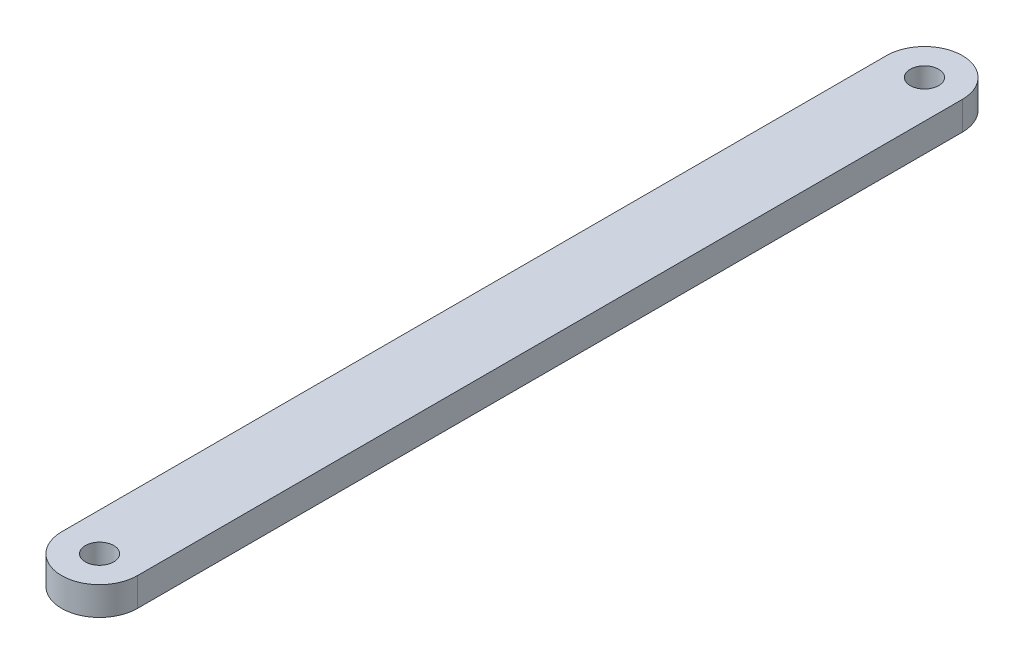
ISO-10303-21;
HEADER;
FILE_DESCRIPTION(('STEP AP214'),'2;1');
FILE_NAME('part.step','',(''),(''),'','','');
FILE_SCHEMA(('AUTOMOTIVE_DESIGN { 1 0 10303 214 1 1 1 1 }'));
ENDSEC;
DATA;
#1=APPLICATION_CONTEXT('core data for automotive mechanical design processes');
#2=APPLICATION_PROTOCOL_DEFINITION('international standard','automotive_design',2000,#1);
#3=PRODUCT_CONTEXT('',#1,'mechanical');
#4=PRODUCT('Part','Part','',(#3));
#5=PRODUCT_RELATED_PRODUCT_CATEGORY('part','',(#4));
#6=PRODUCT_DEFINITION_FORMATION('','',#4);
#7=PRODUCT_DEFINITION_CONTEXT('part definition',#1,'design');
#8=PRODUCT_DEFINITION('design','',#6,#7);
#9=PRODUCT_DEFINITION_SHAPE('','',#8);
#10=(LENGTH_UNIT() NAMED_UNIT(*) SI_UNIT(.MILLI.,.METRE.));
#11=(NAMED_UNIT(*) PLANE_ANGLE_UNIT() SI_UNIT($,.RADIAN.));
#12=(NAMED_UNIT(*) SI_UNIT($,.STERADIAN.) SOLID_ANGLE_UNIT());
#13=UNCERTAINTY_MEASURE_WITH_UNIT(LENGTH_MEASURE(1.E-05),#10,'distance_accuracy_value','');
#14=(GEOMETRIC_REPRESENTATION_CONTEXT(3) GLOBAL_UNCERTAINTY_ASSIGNED_CONTEXT((#13)) GLOBAL_UNIT_ASSIGNED_CONTEXT((#10,
#11,#12)) REPRESENTATION_CONTEXT('',''));
#15=CARTESIAN_POINT('',(0.,0.,0.));
#16=DIRECTION('',(0.,0.,1.));
#17=DIRECTION('',(1.,0.,0.));
#18=AXIS2_PLACEMENT_3D('',#15,#16,#17);
#19=CARTESIAN_POINT('',(41836.1732579615,-395.939495491806,-43.0000000000018));
#20=DIRECTION('',(0.,-1.,0.));
#21=DIRECTION('',(1.,0.,0.));
#22=AXIS2_PLACEMENT_3D('',#19,#20,#21);
#23=PLANE('',#22);
#24=CARTESIAN_POINT('',(41836.1732579615,-395.939495491806,43.9999999999982));
#25=DIRECTION('',(0.,-1.,0.));
#26=DIRECTION('',(1.,0.,0.));
#27=AXIS2_PLACEMENT_3D('',#24,#25,#26);
#28=CIRCLE('',#27,1.50000000000178);
#29=CARTESIAN_POINT('',(41837.6732579615,-395.939495491806,43.9999999999982));
#30=VERTEX_POINT('',#29);
#31=EDGE_CURVE('E107',#30,#30,#28,.T.);
#32=ORIENTED_EDGE('',*,*,#31,.F.);
#33=EDGE_LOOP('',(#32));
#34=FACE_BOUND('',#33,.T.);
#35=CARTESIAN_POINT('',(41836.1732579615,-395.939495491806,-43.0000000000018));
#36=DIRECTION('',(0.,-1.,0.));
#37=DIRECTION('',(1.,0.,0.));
#38=AXIS2_PLACEMENT_3D('',#35,#36,#37);
#39=CIRCLE('',#38,4.00000000000134);
#40=CARTESIAN_POINT('',(41832.1732579615,-395.939495491806,-43.0000000000018));
#41=VERTEX_POINT('',#40);
#42=CARTESIAN_POINT('',(41840.1732579615,-395.939495491806,-43.0000000000018));
#43=VERTEX_POINT('',#42);
#44=EDGE_CURVE('E90',#41,#43,#39,.T.);
#45=ORIENTED_EDGE('',*,*,#44,.T.);
#46=DIRECTION('',(0.,0.,1.));
#47=VECTOR('',#46,1.);
#48=CARTESIAN_POINT('',(41840.1732579615,-395.939495491806,-41.0000000000018));
#49=LINE('',#48,#47);
#50=CARTESIAN_POINT('',(41840.1732579615,-395.939495491806,43.9999999999982));
#51=VERTEX_POINT('',#50);
#52=EDGE_CURVE('E84',#43,#51,#49,.T.);
#53=ORIENTED_EDGE('',*,*,#52,.T.);
#54=CARTESIAN_POINT('',(41836.1732579615,-395.939495491806,43.9999999999982));
#55=DIRECTION('',(0.,-1.,0.));
#56=DIRECTION('',(1.,0.,0.));
#57=AXIS2_PLACEMENT_3D('',#54,#55,#56);
#58=CIRCLE('',#57,4.00000000000489);
#59=CARTESIAN_POINT('',(41832.1732579615,-395.939495491806,43.9999999999982));
#60=VERTEX_POINT('',#59);
#61=EDGE_CURVE('E87',#51,#60,#58,.T.);
#62=ORIENTED_EDGE('',*,*,#61,.T.);
#63=DIRECTION('',(0.,0.,-1.));
#64=VECTOR('',#63,1.);
#65=CARTESIAN_POINT('',(41832.1732579615,-395.939495491806,43.9999999999982));
#66=LINE('',#65,#64);
#67=EDGE_CURVE('E56',#60,#41,#66,.T.);
#68=ORIENTED_EDGE('',*,*,#67,.T.);
#69=EDGE_LOOP('',(#45,#53,#62,#68));
#70=FACE_BOUND('',#69,.T.);
#71=CARTESIAN_POINT('',(41836.1732579615,-395.939495491806,-43.0000000000018));
#72=DIRECTION('',(0.,-1.,0.));
#73=DIRECTION('',(1.,0.,0.));
#74=AXIS2_PLACEMENT_3D('',#71,#72,#73);
#75=CIRCLE('',#74,1.50000000000178);
#76=CARTESIAN_POINT('',(41837.6732579615,-395.939495491806,-43.0000000000018));
#77=VERTEX_POINT('',#76);
#78=EDGE_CURVE('E119',#77,#77,#75,.T.);
#79=ORIENTED_EDGE('',*,*,#78,.F.);
#80=EDGE_LOOP('',(#79));
#81=FACE_BOUND('',#80,.T.);
#82=ADVANCED_FACE('F39',(#34,#70,#81),#23,.T.);
#83=CARTESIAN_POINT('',(41836.1732579615,-392.939495491806,-43.0000000000018));
#84=DIRECTION('',(0.,-1.,0.));
#85=DIRECTION('',(1.,0.,0.));
#86=AXIS2_PLACEMENT_3D('',#83,#84,#85);
#87=PLANE('',#86);
#88=CARTESIAN_POINT('',(41836.1732579615,-392.939495491806,-43.0000000000018));
#89=DIRECTION('',(0.,-1.,0.));
#90=DIRECTION('',(1.,0.,0.));
#91=AXIS2_PLACEMENT_3D('',#88,#89,#90);
#92=CIRCLE('',#91,4.00000000000134);
#93=CARTESIAN_POINT('',(41832.1732579615,-392.939495491806,-43.0000000000018));
#94=VERTEX_POINT('',#93);
#95=CARTESIAN_POINT('',(41840.1732579615,-392.939495491806,-43.0000000000018));
#96=VERTEX_POINT('',#95);
#97=EDGE_CURVE('E104',#94,#96,#92,.T.);
#98=ORIENTED_EDGE('',*,*,#97,.F.);
#99=DIRECTION('',(0.,0.,-1.));
#100=VECTOR('',#99,1.);
#101=CARTESIAN_POINT('',(41832.1732579615,-392.939495491806,-41.0000000000018));
#102=LINE('',#101,#100);
#103=CARTESIAN_POINT('',(41832.1732579615,-392.939495491806,43.9999999999982));
#104=VERTEX_POINT('',#103);
#105=EDGE_CURVE('E73',#104,#94,#102,.T.);
#106=ORIENTED_EDGE('',*,*,#105,.F.);
#107=CARTESIAN_POINT('',(41836.1732579615,-392.939495491806,43.9999999999982));
#108=DIRECTION('',(0.,-1.,0.));
#109=DIRECTION('',(1.,0.,0.));
#110=AXIS2_PLACEMENT_3D('',#107,#108,#109);
#111=CIRCLE('',#110,4.00000000000489);
#112=CARTESIAN_POINT('',(41840.1732579615,-392.939495491806,43.9999999999982));
#113=VERTEX_POINT('',#112);
#114=EDGE_CURVE('E109',#113,#104,#111,.T.);
#115=ORIENTED_EDGE('',*,*,#114,.F.);
#116=DIRECTION('',(0.,0.,1.));
#117=VECTOR('',#116,1.);
#118=CARTESIAN_POINT('',(41840.1732579615,-392.939495491806,-41.0000000000018));
#119=LINE('',#118,#117);
#120=EDGE_CURVE('E95',#96,#113,#119,.T.);
#121=ORIENTED_EDGE('',*,*,#120,.F.);
#122=EDGE_LOOP('',(#98,#106,#115,#121));
#123=FACE_BOUND('',#122,.T.);
#124=CARTESIAN_POINT('',(41836.1732579615,-392.939495491806,43.9999999999982));
#125=DIRECTION('',(0.,-1.,0.));
#126=DIRECTION('',(1.,0.,0.));
#127=AXIS2_PLACEMENT_3D('',#124,#125,#126);
#128=CIRCLE('',#127,1.50000000000178);
#129=CARTESIAN_POINT('',(41837.6732579615,-392.939495491806,43.9999999999982));
#130=VERTEX_POINT('',#129);
#131=EDGE_CURVE('E116',#130,#130,#128,.T.);
#132=ORIENTED_EDGE('',*,*,#131,.T.);
#133=EDGE_LOOP('',(#132));
#134=FACE_BOUND('',#133,.T.);
#135=CARTESIAN_POINT('',(41836.1732579615,-392.939495491806,-43.0000000000018));
#136=DIRECTION('',(0.,-1.,0.));
#137=DIRECTION('',(1.,0.,0.));
#138=AXIS2_PLACEMENT_3D('',#135,#136,#137);
#139=CIRCLE('',#138,1.50000000000178);
#140=CARTESIAN_POINT('',(41837.6732579615,-392.939495491806,-43.0000000000018));
#141=VERTEX_POINT('',#140);
#142=EDGE_CURVE('E122',#141,#141,#139,.T.);
#143=ORIENTED_EDGE('',*,*,#142,.T.);
#144=EDGE_LOOP('',(#143));
#145=FACE_BOUND('',#144,.T.);
#146=ADVANCED_FACE('F131',(#123,#134,#145),#87,.F.);
#147=CARTESIAN_POINT('',(41836.1732579615,-395.939495491806,-43.0000000000018));
#148=DIRECTION('',(0.,1.,0.));
#149=DIRECTION('',(-1.,0.,0.));
#150=AXIS2_PLACEMENT_3D('',#147,#148,#149);
#151=CYLINDRICAL_SURFACE('',#150,4.00000000000134);
#152=ORIENTED_EDGE('',*,*,#97,.T.);
#153=DIRECTION('',(0.,1.,0.));
#154=VECTOR('',#153,1.);
#155=CARTESIAN_POINT('',(41840.1732579615,-395.939495491806,-43.0000000000018));
#156=LINE('',#155,#154);
#157=EDGE_CURVE('E11',#43,#96,#156,.T.);
#158=ORIENTED_EDGE('',*,*,#157,.F.);
#159=ORIENTED_EDGE('',*,*,#44,.F.);
#160=DIRECTION('',(0.,1.,0.));
#161=VECTOR('',#160,1.);
#162=CARTESIAN_POINT('',(41832.1732579615,-395.939495491806,-43.0000000000018));
#163=LINE('',#162,#161);
#164=EDGE_CURVE('E100',#41,#94,#163,.T.);
#165=ORIENTED_EDGE('',*,*,#164,.T.);
#166=EDGE_LOOP('',(#152,#158,#159,#165));
#167=FACE_BOUND('',#166,.T.);
#168=ADVANCED_FACE('F41',(#167),#151,.T.);
#169=CARTESIAN_POINT('',(41840.1732579615,-395.939495491806,-41.0000000000018));
#170=DIRECTION('',(-1.,0.,0.));
#171=DIRECTION('',(0.,-1.,0.));
#172=AXIS2_PLACEMENT_3D('',#169,#170,#171);
#173=PLANE('',#172);
#174=ORIENTED_EDGE('',*,*,#120,.T.);
#175=DIRECTION('',(0.,1.,0.));
#176=VECTOR('',#175,1.);
#177=CARTESIAN_POINT('',(41840.1732579615,-395.939495491806,43.9999999999982));
#178=LINE('',#177,#176);
#179=EDGE_CURVE('E48',#51,#113,#178,.T.);
#180=ORIENTED_EDGE('',*,*,#179,.F.);
#181=ORIENTED_EDGE('',*,*,#52,.F.);
#182=ORIENTED_EDGE('',*,*,#157,.T.);
#183=EDGE_LOOP('',(#174,#180,#181,#182));
#184=FACE_BOUND('',#183,.T.);
#185=ADVANCED_FACE('F94',(#184),#173,.F.);
#186=CARTESIAN_POINT('',(41836.1732579615,-395.939495491806,43.9999999999982));
#187=DIRECTION('',(0.,1.,0.));
#188=DIRECTION('',(-1.,0.,0.));
#189=AXIS2_PLACEMENT_3D('',#186,#187,#188);
#190=CYLINDRICAL_SURFACE('',#189,4.00000000000489);
#191=ORIENTED_EDGE('',*,*,#114,.T.);
#192=DIRECTION('',(0.,1.,0.));
#193=VECTOR('',#192,1.);
#194=CARTESIAN_POINT('',(41832.1732579615,-395.939495491806,43.9999999999982));
#195=LINE('',#194,#193);
#196=EDGE_CURVE('E97',#60,#104,#195,.T.);
#197=ORIENTED_EDGE('',*,*,#196,.F.);
#198=ORIENTED_EDGE('',*,*,#61,.F.);
#199=ORIENTED_EDGE('',*,*,#179,.T.);
#200=EDGE_LOOP('',(#191,#197,#198,#199));
#201=FACE_BOUND('',#200,.T.);
#202=ADVANCED_FACE('F98',(#201),#190,.T.);
#203=CARTESIAN_POINT('',(41832.1732579615,-395.939495491806,-41.0000000000018));
#204=DIRECTION('',(1.,0.,0.));
#205=DIRECTION('',(0.,1.,0.));
#206=AXIS2_PLACEMENT_3D('',#203,#204,#205);
#207=PLANE('',#206);
#208=ORIENTED_EDGE('',*,*,#105,.T.);
#209=ORIENTED_EDGE('',*,*,#164,.F.);
#210=ORIENTED_EDGE('',*,*,#67,.F.);
#211=ORIENTED_EDGE('',*,*,#196,.T.);
#212=EDGE_LOOP('',(#208,#209,#210,#211));
#213=FACE_BOUND('',#212,.T.);
#214=ADVANCED_FACE('F113',(#213),#207,.F.);
#215=CARTESIAN_POINT('',(41836.1732579615,-395.939495491806,43.9999999999982));
#216=DIRECTION('',(0.,1.,0.));
#217=DIRECTION('',(-1.,0.,0.));
#218=AXIS2_PLACEMENT_3D('',#215,#216,#217);
#219=CYLINDRICAL_SURFACE('',#218,1.50000000000178);
#220=ORIENTED_EDGE('',*,*,#31,.T.);
#221=EDGE_LOOP('',(#220));
#222=FACE_BOUND('',#221,.T.);
#223=ORIENTED_EDGE('',*,*,#131,.F.);
#224=EDGE_LOOP('',(#223));
#225=FACE_BOUND('',#224,.T.);
#226=ADVANCED_FACE('F140',(#222,#225),#219,.F.);
#227=CARTESIAN_POINT('',(41836.1732579615,-395.939495491806,-43.0000000000018));
#228=DIRECTION('',(0.,1.,0.));
#229=DIRECTION('',(-1.,0.,0.));
#230=AXIS2_PLACEMENT_3D('',#227,#228,#229);
#231=CYLINDRICAL_SURFACE('',#230,1.50000000000178);
#232=ORIENTED_EDGE('',*,*,#78,.T.);
#233=EDGE_LOOP('',(#232));
#234=FACE_BOUND('',#233,.T.);
#235=ORIENTED_EDGE('',*,*,#142,.F.);
#236=EDGE_LOOP('',(#235));
#237=FACE_BOUND('',#236,.T.);
#238=ADVANCED_FACE('F128',(#234,#237),#231,.F.);
#239=CLOSED_SHELL('',(#82,#146,#168,#185,#202,#214,#226,#238));
#240=MANIFOLD_SOLID_BREP('B2',#239);
#241=ADVANCED_BREP_SHAPE_REPRESENTATION('',(#18,#240),#14);
#242=SHAPE_DEFINITION_REPRESENTATION(#9,#241);
ENDSEC;
END-ISO-10303-21;
